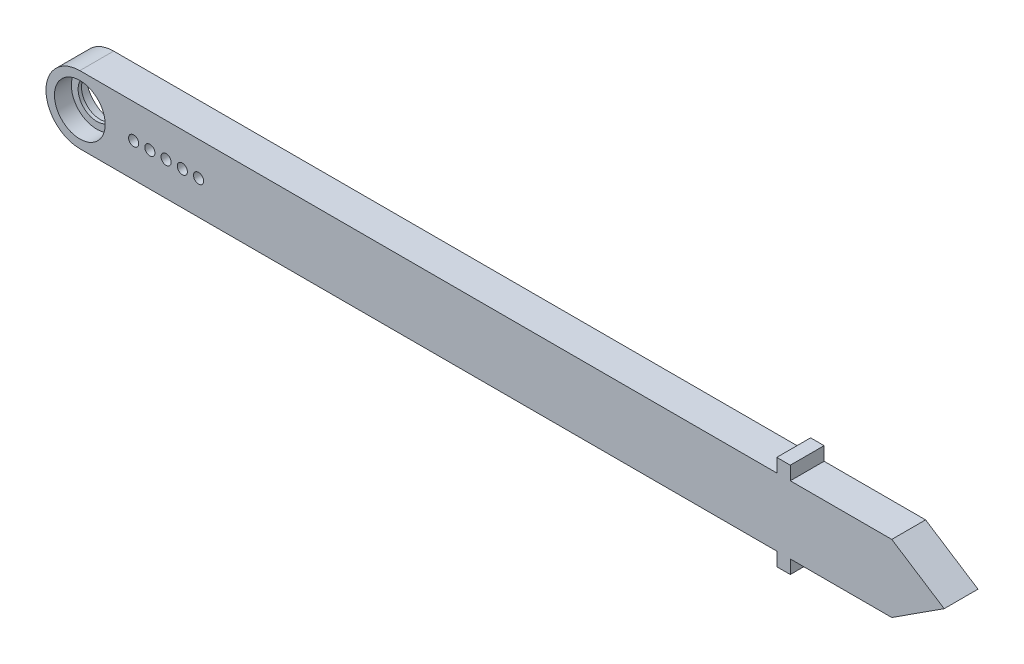
ISO-10303-21;
HEADER;
FILE_DESCRIPTION(('STEP AP214'),'2;1');
FILE_NAME('part.step','',(''),(''),'','','');
FILE_SCHEMA(('AUTOMOTIVE_DESIGN { 1 0 10303 214 1 1 1 1 }'));
ENDSEC;
DATA;
#1=APPLICATION_CONTEXT('core data for automotive mechanical design processes');
#2=APPLICATION_PROTOCOL_DEFINITION('international standard','automotive_design',2000,#1);
#3=PRODUCT_CONTEXT('',#1,'mechanical');
#4=PRODUCT('Part','Part','',(#3));
#5=PRODUCT_RELATED_PRODUCT_CATEGORY('part','',(#4));
#6=PRODUCT_DEFINITION_FORMATION('','',#4);
#7=PRODUCT_DEFINITION_CONTEXT('part definition',#1,'design');
#8=PRODUCT_DEFINITION('design','',#6,#7);
#9=PRODUCT_DEFINITION_SHAPE('','',#8);
#10=(LENGTH_UNIT() NAMED_UNIT(*) SI_UNIT(.MILLI.,.METRE.));
#11=(NAMED_UNIT(*) PLANE_ANGLE_UNIT() SI_UNIT($,.RADIAN.));
#12=(NAMED_UNIT(*) SI_UNIT($,.STERADIAN.) SOLID_ANGLE_UNIT());
#13=UNCERTAINTY_MEASURE_WITH_UNIT(LENGTH_MEASURE(1.E-05),#10,'distance_accuracy_value','');
#14=(GEOMETRIC_REPRESENTATION_CONTEXT(3) GLOBAL_UNCERTAINTY_ASSIGNED_CONTEXT((#13)) GLOBAL_UNIT_ASSIGNED_CONTEXT((#10,
#11,#12)) REPRESENTATION_CONTEXT('',''));
#15=CARTESIAN_POINT('',(0.,0.,0.));
#16=DIRECTION('',(0.,0.,1.));
#17=DIRECTION('',(1.,0.,0.));
#18=AXIS2_PLACEMENT_3D('',#15,#16,#17);
#19=CARTESIAN_POINT('',(0.,-5.,5.));
#20=DIRECTION('',(0.,1.,0.));
#21=DIRECTION('',(0.,0.,1.));
#22=AXIS2_PLACEMENT_3D('',#19,#20,#21);
#23=PLANE('',#22);
#24=DIRECTION('',(1.,0.,0.));
#25=VECTOR('',#24,1.);
#26=CARTESIAN_POINT('',(0.,-5.,5.));
#27=LINE('',#26,#25);
#28=CARTESIAN_POINT('',(105.,-5.,5.));
#29=VERTEX_POINT('',#28);
#30=CARTESIAN_POINT('',(120.,-5.,5.));
#31=VERTEX_POINT('',#30);
#32=EDGE_CURVE('E183',#29,#31,#27,.T.);
#33=ORIENTED_EDGE('',*,*,#32,.F.);
#34=DIRECTION('',(0.,0.,-1.));
#35=VECTOR('',#34,1.);
#36=CARTESIAN_POINT('',(105.,-5.,5.));
#37=LINE('',#36,#35);
#38=CARTESIAN_POINT('',(105.,-5.,0.));
#39=VERTEX_POINT('',#38);
#40=EDGE_CURVE('E230',#29,#39,#37,.T.);
#41=ORIENTED_EDGE('',*,*,#40,.T.);
#42=DIRECTION('',(1.,0.,0.));
#43=VECTOR('',#42,1.);
#44=CARTESIAN_POINT('',(0.,-5.,0.));
#45=LINE('',#44,#43);
#46=CARTESIAN_POINT('',(120.,-5.,0.));
#47=VERTEX_POINT('',#46);
#48=EDGE_CURVE('E289',#39,#47,#45,.T.);
#49=ORIENTED_EDGE('',*,*,#48,.T.);
#50=DIRECTION('',(0.,0.,-1.));
#51=VECTOR('',#50,1.);
#52=CARTESIAN_POINT('',(120.,-5.,5.));
#53=LINE('',#52,#51);
#54=EDGE_CURVE('E11',#31,#47,#53,.T.);
#55=ORIENTED_EDGE('',*,*,#54,.F.);
#56=EDGE_LOOP('',(#33,#41,#49,#55));
#57=FACE_BOUND('',#56,.T.);
#58=ADVANCED_FACE('F40',(#57),#23,.F.);
#59=CARTESIAN_POINT('',(0.,5.,5.));
#60=DIRECTION('',(0.,1.,0.));
#61=DIRECTION('',(0.,0.,1.));
#62=AXIS2_PLACEMENT_3D('',#59,#60,#61);
#63=PLANE('',#62);
#64=DIRECTION('',(1.,0.,0.));
#65=VECTOR('',#64,1.);
#66=CARTESIAN_POINT('',(0.,5.,5.));
#67=LINE('',#66,#65);
#68=CARTESIAN_POINT('',(0.,5.,5.));
#69=VERTEX_POINT('',#68);
#70=CARTESIAN_POINT('',(103.,5.,5.));
#71=VERTEX_POINT('',#70);
#72=EDGE_CURVE('E299',#69,#71,#67,.T.);
#73=ORIENTED_EDGE('',*,*,#72,.T.);
#74=DIRECTION('',(0.,0.,1.));
#75=VECTOR('',#74,1.);
#76=CARTESIAN_POINT('',(103.,5.,0.));
#77=LINE('',#76,#75);
#78=CARTESIAN_POINT('',(103.,5.,0.));
#79=VERTEX_POINT('',#78);
#80=EDGE_CURVE('E233',#79,#71,#77,.T.);
#81=ORIENTED_EDGE('',*,*,#80,.F.);
#82=DIRECTION('',(1.,0.,0.));
#83=VECTOR('',#82,1.);
#84=CARTESIAN_POINT('',(0.,5.,0.));
#85=LINE('',#84,#83);
#86=CARTESIAN_POINT('',(0.,5.,0.));
#87=VERTEX_POINT('',#86);
#88=EDGE_CURVE('E312',#87,#79,#85,.T.);
#89=ORIENTED_EDGE('',*,*,#88,.F.);
#90=DIRECTION('',(0.,0.,-1.));
#91=VECTOR('',#90,1.);
#92=CARTESIAN_POINT('',(0.,5.,5.));
#93=LINE('',#92,#91);
#94=EDGE_CURVE('E319',#69,#87,#93,.T.);
#95=ORIENTED_EDGE('',*,*,#94,.F.);
#96=EDGE_LOOP('',(#73,#81,#89,#95));
#97=FACE_BOUND('',#96,.T.);
#98=ADVANCED_FACE('F372',(#97),#63,.T.);
#99=CARTESIAN_POINT('',(105.,5.,0.));
#100=VERTEX_POINT('',#99);
#101=CARTESIAN_POINT('',(120.,5.,0.));
#102=VERTEX_POINT('',#101);
#103=EDGE_CURVE('E311',#100,#102,#85,.T.);
#104=ORIENTED_EDGE('',*,*,#103,.F.);
#105=DIRECTION('',(0.,0.,-1.));
#106=VECTOR('',#105,1.);
#107=CARTESIAN_POINT('',(105.,5.,0.));
#108=LINE('',#107,#106);
#109=CARTESIAN_POINT('',(105.,5.,5.));
#110=VERTEX_POINT('',#109);
#111=EDGE_CURVE('E238',#110,#100,#108,.T.);
#112=ORIENTED_EDGE('',*,*,#111,.F.);
#113=CARTESIAN_POINT('',(120.,5.,5.));
#114=VERTEX_POINT('',#113);
#115=EDGE_CURVE('E298',#110,#114,#67,.T.);
#116=ORIENTED_EDGE('',*,*,#115,.T.);
#117=DIRECTION('',(0.,0.,-1.));
#118=VECTOR('',#117,1.);
#119=CARTESIAN_POINT('',(120.,5.,5.));
#120=LINE('',#119,#118);
#121=EDGE_CURVE('E49',#114,#102,#120,.T.);
#122=ORIENTED_EDGE('',*,*,#121,.T.);
#123=EDGE_LOOP('',(#104,#112,#116,#122));
#124=FACE_BOUND('',#123,.T.);
#125=ADVANCED_FACE('F377',(#124),#63,.T.);
#126=CARTESIAN_POINT('',(0.,0.,5.));
#127=DIRECTION('',(0.,0.,-1.));
#128=DIRECTION('',(-1.,0.,0.));
#129=AXIS2_PLACEMENT_3D('',#126,#127,#128);
#130=CYLINDRICAL_SURFACE('',#129,3.75);
#131=CARTESIAN_POINT('',(0.,0.,5.));
#132=DIRECTION('',(0.,0.,1.));
#133=DIRECTION('',(1.,0.,0.));
#134=AXIS2_PLACEMENT_3D('',#131,#132,#133);
#135=CIRCLE('',#134,3.75);
#136=CARTESIAN_POINT('',(3.75,0.,5.));
#137=VERTEX_POINT('',#136);
#138=EDGE_CURVE('E304',#137,#137,#135,.T.);
#139=ORIENTED_EDGE('',*,*,#138,.T.);
#140=EDGE_LOOP('',(#139));
#141=FACE_BOUND('',#140,.T.);
#142=CARTESIAN_POINT('',(0.,0.,2.5));
#143=DIRECTION('',(0.,0.,-1.));
#144=DIRECTION('',(-1.,0.,0.));
#145=AXIS2_PLACEMENT_3D('',#142,#143,#144);
#146=CIRCLE('',#145,3.75);
#147=CARTESIAN_POINT('',(-3.75,0.,2.5));
#148=VERTEX_POINT('',#147);
#149=EDGE_CURVE('E258',#148,#148,#146,.T.);
#150=ORIENTED_EDGE('',*,*,#149,.T.);
#151=EDGE_LOOP('',(#150));
#152=FACE_BOUND('',#151,.T.);
#153=ADVANCED_FACE('F381',(#141,#152),#130,.F.);
#154=CARTESIAN_POINT('',(0.,-5.,0.));
#155=VERTEX_POINT('',#154);
#156=CARTESIAN_POINT('',(103.,-5.,0.));
#157=VERTEX_POINT('',#156);
#158=EDGE_CURVE('E308',#155,#157,#45,.T.);
#159=ORIENTED_EDGE('',*,*,#158,.T.);
#160=DIRECTION('',(0.,0.,1.));
#161=VECTOR('',#160,1.);
#162=CARTESIAN_POINT('',(103.,-5.,5.));
#163=LINE('',#162,#161);
#164=CARTESIAN_POINT('',(103.,-5.,5.));
#165=VERTEX_POINT('',#164);
#166=EDGE_CURVE('E223',#157,#165,#163,.T.);
#167=ORIENTED_EDGE('',*,*,#166,.T.);
#168=CARTESIAN_POINT('',(0.,-5.,5.));
#169=VERTEX_POINT('',#168);
#170=EDGE_CURVE('E296',#169,#165,#27,.T.);
#171=ORIENTED_EDGE('',*,*,#170,.F.);
#172=DIRECTION('',(0.,0.,-1.));
#173=VECTOR('',#172,1.);
#174=CARTESIAN_POINT('',(0.,-5.,5.));
#175=LINE('',#174,#173);
#176=EDGE_CURVE('E307',#169,#155,#175,.T.);
#177=ORIENTED_EDGE('',*,*,#176,.T.);
#178=EDGE_LOOP('',(#159,#167,#171,#177));
#179=FACE_BOUND('',#178,.T.);
#180=ADVANCED_FACE('F42',(#179),#23,.F.);
#181=CARTESIAN_POINT('',(0.,0.,5.));
#182=DIRECTION('',(0.,0.,-1.));
#183=DIRECTION('',(-1.,0.,0.));
#184=AXIS2_PLACEMENT_3D('',#181,#182,#183);
#185=CYLINDRICAL_SURFACE('',#184,5.);
#186=CARTESIAN_POINT('',(0.,0.,0.));
#187=DIRECTION('',(0.,0.,1.));
#188=DIRECTION('',(1.,0.,0.));
#189=AXIS2_PLACEMENT_3D('',#186,#187,#188);
#190=CIRCLE('',#189,5.);
#191=EDGE_CURVE('E315',#87,#155,#190,.T.);
#192=ORIENTED_EDGE('',*,*,#191,.T.);
#193=ORIENTED_EDGE('',*,*,#176,.F.);
#194=CARTESIAN_POINT('',(0.,0.,5.));
#195=DIRECTION('',(0.,0.,1.));
#196=DIRECTION('',(1.,0.,0.));
#197=AXIS2_PLACEMENT_3D('',#194,#195,#196);
#198=CIRCLE('',#197,5.);
#199=EDGE_CURVE('E302',#69,#169,#198,.T.);
#200=ORIENTED_EDGE('',*,*,#199,.F.);
#201=ORIENTED_EDGE('',*,*,#94,.T.);
#202=EDGE_LOOP('',(#192,#193,#200,#201));
#203=FACE_BOUND('',#202,.T.);
#204=ADVANCED_FACE('F380',(#203),#185,.T.);
#205=CARTESIAN_POINT('',(0.,0.,5.));
#206=DIRECTION('',(0.,0.,1.));
#207=DIRECTION('',(1.,0.,0.));
#208=AXIS2_PLACEMENT_3D('',#205,#206,#207);
#209=PLANE('',#208);
#210=CARTESIAN_POINT('',(17.55,0.,5.));
#211=DIRECTION('',(0.,0.,-1.));
#212=DIRECTION('',(-1.,0.,0.));
#213=AXIS2_PLACEMENT_3D('',#210,#211,#212);
#214=CIRCLE('',#213,0.749999999999998);
#215=CARTESIAN_POINT('',(16.8,0.,5.));
#216=VERTEX_POINT('',#215);
#217=EDGE_CURVE('E194',#216,#216,#214,.T.);
#218=ORIENTED_EDGE('',*,*,#217,.T.);
#219=EDGE_LOOP('',(#218));
#220=FACE_BOUND('',#219,.T.);
#221=CARTESIAN_POINT('',(10.35,0.,5.));
#222=DIRECTION('',(0.,0.,-1.));
#223=DIRECTION('',(-1.,0.,0.));
#224=AXIS2_PLACEMENT_3D('',#221,#222,#223);
#225=CIRCLE('',#224,0.75);
#226=CARTESIAN_POINT('',(9.6,0.,5.));
#227=VERTEX_POINT('',#226);
#228=EDGE_CURVE('E198',#227,#227,#225,.T.);
#229=ORIENTED_EDGE('',*,*,#228,.T.);
#230=EDGE_LOOP('',(#229));
#231=FACE_BOUND('',#230,.T.);
#232=CARTESIAN_POINT('',(7.95,0.,5.));
#233=DIRECTION('',(0.,0.,-1.));
#234=DIRECTION('',(-1.,0.,0.));
#235=AXIS2_PLACEMENT_3D('',#232,#233,#234);
#236=CIRCLE('',#235,0.75);
#237=CARTESIAN_POINT('',(7.2,0.,5.));
#238=VERTEX_POINT('',#237);
#239=EDGE_CURVE('E201',#238,#238,#236,.T.);
#240=ORIENTED_EDGE('',*,*,#239,.T.);
#241=EDGE_LOOP('',(#240));
#242=FACE_BOUND('',#241,.T.);
#243=CARTESIAN_POINT('',(12.75,0.,5.));
#244=DIRECTION('',(0.,0.,-1.));
#245=DIRECTION('',(-1.,0.,0.));
#246=AXIS2_PLACEMENT_3D('',#243,#244,#245);
#247=CIRCLE('',#246,0.75);
#248=CARTESIAN_POINT('',(12.,0.,5.));
#249=VERTEX_POINT('',#248);
#250=EDGE_CURVE('E204',#249,#249,#247,.T.);
#251=ORIENTED_EDGE('',*,*,#250,.T.);
#252=EDGE_LOOP('',(#251));
#253=FACE_BOUND('',#252,.T.);
#254=CARTESIAN_POINT('',(15.15,0.,5.));
#255=DIRECTION('',(0.,0.,-1.));
#256=DIRECTION('',(-1.,0.,0.));
#257=AXIS2_PLACEMENT_3D('',#254,#255,#256);
#258=CIRCLE('',#257,0.75);
#259=CARTESIAN_POINT('',(14.4,0.,5.));
#260=VERTEX_POINT('',#259);
#261=EDGE_CURVE('E193',#260,#260,#258,.T.);
#262=ORIENTED_EDGE('',*,*,#261,.T.);
#263=EDGE_LOOP('',(#262));
#264=FACE_BOUND('',#263,.T.);
#265=ORIENTED_EDGE('',*,*,#170,.T.);
#266=DIRECTION('',(0.,1.,0.));
#267=VECTOR('',#266,1.);
#268=CARTESIAN_POINT('',(103.,-7.,5.));
#269=LINE('',#268,#267);
#270=CARTESIAN_POINT('',(103.,-7.,5.));
#271=VERTEX_POINT('',#270);
#272=EDGE_CURVE('E57',#271,#165,#269,.T.);
#273=ORIENTED_EDGE('',*,*,#272,.F.);
#274=DIRECTION('',(1.,0.,0.));
#275=VECTOR('',#274,1.);
#276=CARTESIAN_POINT('',(103.,-7.,5.));
#277=LINE('',#276,#275);
#278=CARTESIAN_POINT('',(105.,-7.,5.));
#279=VERTEX_POINT('',#278);
#280=EDGE_CURVE('E214',#271,#279,#277,.T.);
#281=ORIENTED_EDGE('',*,*,#280,.T.);
#282=DIRECTION('',(0.,1.,0.));
#283=VECTOR('',#282,1.);
#284=CARTESIAN_POINT('',(105.,-7.,5.));
#285=LINE('',#284,#283);
#286=EDGE_CURVE('E224',#279,#29,#285,.T.);
#287=ORIENTED_EDGE('',*,*,#286,.T.);
#288=ORIENTED_EDGE('',*,*,#32,.T.);
#289=DIRECTION('',(0.840080797820582,0.542461291829319,0.));
#290=VECTOR('',#289,1.);
#291=CARTESIAN_POINT('',(127.743232655252,0.,5.));
#292=LINE('',#291,#290);
#293=CARTESIAN_POINT('',(127.743232655252,0.,5.));
#294=VERTEX_POINT('',#293);
#295=EDGE_CURVE('E166',#31,#294,#292,.T.);
#296=ORIENTED_EDGE('',*,*,#295,.T.);
#297=DIRECTION('',(-0.840080797820582,0.542461291829319,0.));
#298=VECTOR('',#297,1.);
#299=CARTESIAN_POINT('',(120.,5.,5.));
#300=LINE('',#299,#298);
#301=EDGE_CURVE('E173',#294,#114,#300,.T.);
#302=ORIENTED_EDGE('',*,*,#301,.T.);
#303=ORIENTED_EDGE('',*,*,#115,.F.);
#304=DIRECTION('',(0.,-1.,0.));
#305=VECTOR('',#304,1.);
#306=CARTESIAN_POINT('',(105.,7.,5.));
#307=LINE('',#306,#305);
#308=CARTESIAN_POINT('',(105.,7.,5.));
#309=VERTEX_POINT('',#308);
#310=EDGE_CURVE('E247',#309,#110,#307,.T.);
#311=ORIENTED_EDGE('',*,*,#310,.F.);
#312=DIRECTION('',(1.,0.,0.));
#313=VECTOR('',#312,1.);
#314=CARTESIAN_POINT('',(103.,7.,5.));
#315=LINE('',#314,#313);
#316=CARTESIAN_POINT('',(103.,7.,5.));
#317=VERTEX_POINT('',#316);
#318=EDGE_CURVE('E240',#317,#309,#315,.T.);
#319=ORIENTED_EDGE('',*,*,#318,.F.);
#320=DIRECTION('',(0.,-1.,0.));
#321=VECTOR('',#320,1.);
#322=CARTESIAN_POINT('',(103.,7.,5.));
#323=LINE('',#322,#321);
#324=EDGE_CURVE('E249',#317,#71,#323,.T.);
#325=ORIENTED_EDGE('',*,*,#324,.T.);
#326=ORIENTED_EDGE('',*,*,#72,.F.);
#327=ORIENTED_EDGE('',*,*,#199,.T.);
#328=EDGE_LOOP('',(#265,#273,#281,#287,#288,#296,#302,#303,#311,#319,#325,#326,#327));
#329=FACE_BOUND('',#328,.T.);
#330=ORIENTED_EDGE('',*,*,#138,.F.);
#331=EDGE_LOOP('',(#330));
#332=FACE_BOUND('',#331,.T.);
#333=ADVANCED_FACE('F178',(#220,#231,#242,#253,#264,#329,#332),#209,.T.);
#334=CARTESIAN_POINT('',(0.,0.,0.));
#335=DIRECTION('',(0.,0.,1.));
#336=DIRECTION('',(1.,0.,0.));
#337=AXIS2_PLACEMENT_3D('',#334,#335,#336);
#338=PLANE('',#337);
#339=DIRECTION('',(-0.996512851135206,-0.0834394242692445,0.));
#340=VECTOR('',#339,1.);
#341=CARTESIAN_POINT('',(16.1297188837247,-2.74943592473536,0.));
#342=LINE('',#341,#340);
#343=CARTESIAN_POINT('',(16.1297188837247,-2.74943592473536,0.));
#344=VERTEX_POINT('',#343);
#345=CARTESIAN_POINT('',(0.,-4.1,0.));
#346=VERTEX_POINT('',#345);
#347=EDGE_CURVE('E279',#344,#346,#342,.T.);
#348=ORIENTED_EDGE('',*,*,#347,.F.);
#349=CARTESIAN_POINT('',(15.6,0.,0.));
#350=DIRECTION('',(0.,0.,-1.));
#351=DIRECTION('',(-1.,0.,0.));
#352=AXIS2_PLACEMENT_3D('',#349,#350,#351);
#353=CIRCLE('',#352,2.8);
#354=CARTESIAN_POINT('',(16.1297188837248,2.74943592473537,0.));
#355=VERTEX_POINT('',#354);
#356=EDGE_CURVE('E263',#355,#344,#353,.T.);
#357=ORIENTED_EDGE('',*,*,#356,.F.);
#358=DIRECTION('',(0.996512851135206,-0.0834394242692436,0.));
#359=VECTOR('',#358,1.);
#360=CARTESIAN_POINT('',(16.1297188837248,2.74943592473537,0.));
#361=LINE('',#360,#359);
#362=CARTESIAN_POINT('',(0.,4.1,0.));
#363=VERTEX_POINT('',#362);
#364=EDGE_CURVE('E268',#363,#355,#361,.T.);
#365=ORIENTED_EDGE('',*,*,#364,.F.);
#366=CARTESIAN_POINT('',(0.,0.,0.));
#367=DIRECTION('',(0.,0.,-1.));
#368=DIRECTION('',(-1.,0.,0.));
#369=AXIS2_PLACEMENT_3D('',#366,#367,#368);
#370=CIRCLE('',#369,4.1);
#371=EDGE_CURVE('E282',#346,#363,#370,.T.);
#372=ORIENTED_EDGE('',*,*,#371,.F.);
#373=EDGE_LOOP('',(#348,#357,#365,#372));
#374=FACE_BOUND('',#373,.T.);
#375=ORIENTED_EDGE('',*,*,#88,.T.);
#376=DIRECTION('',(0.,-1.,0.));
#377=VECTOR('',#376,1.);
#378=CARTESIAN_POINT('',(103.,7.,0.));
#379=LINE('',#378,#377);
#380=CARTESIAN_POINT('',(103.,7.,0.));
#381=VERTEX_POINT('',#380);
#382=EDGE_CURVE('E252',#381,#79,#379,.T.);
#383=ORIENTED_EDGE('',*,*,#382,.F.);
#384=DIRECTION('',(-1.,0.,0.));
#385=VECTOR('',#384,1.);
#386=CARTESIAN_POINT('',(103.,7.,0.));
#387=LINE('',#386,#385);
#388=CARTESIAN_POINT('',(105.,7.,0.));
#389=VERTEX_POINT('',#388);
#390=EDGE_CURVE('E234',#389,#381,#387,.T.);
#391=ORIENTED_EDGE('',*,*,#390,.F.);
#392=DIRECTION('',(0.,-1.,0.));
#393=VECTOR('',#392,1.);
#394=CARTESIAN_POINT('',(105.,7.,0.));
#395=LINE('',#394,#393);
#396=EDGE_CURVE('E65',#389,#100,#395,.T.);
#397=ORIENTED_EDGE('',*,*,#396,.T.);
#398=ORIENTED_EDGE('',*,*,#103,.T.);
#399=DIRECTION('',(0.840080797820583,-0.542461291829319,0.));
#400=VECTOR('',#399,1.);
#401=CARTESIAN_POINT('',(120.,5.,0.));
#402=LINE('',#401,#400);
#403=CARTESIAN_POINT('',(127.743232655252,0.,0.));
#404=VERTEX_POINT('',#403);
#405=EDGE_CURVE('E172',#102,#404,#402,.T.);
#406=ORIENTED_EDGE('',*,*,#405,.T.);
#407=DIRECTION('',(-0.840080797820583,-0.542461291829319,0.));
#408=VECTOR('',#407,1.);
#409=CARTESIAN_POINT('',(127.743232655252,0.,0.));
#410=LINE('',#409,#408);
#411=EDGE_CURVE('E168',#404,#47,#410,.T.);
#412=ORIENTED_EDGE('',*,*,#411,.T.);
#413=ORIENTED_EDGE('',*,*,#48,.F.);
#414=DIRECTION('',(0.,1.,0.));
#415=VECTOR('',#414,1.);
#416=CARTESIAN_POINT('',(105.,-7.,0.));
#417=LINE('',#416,#415);
#418=CARTESIAN_POINT('',(105.,-7.,0.));
#419=VERTEX_POINT('',#418);
#420=EDGE_CURVE('E221',#419,#39,#417,.T.);
#421=ORIENTED_EDGE('',*,*,#420,.F.);
#422=DIRECTION('',(-1.,0.,0.));
#423=VECTOR('',#422,1.);
#424=CARTESIAN_POINT('',(103.,-7.,0.));
#425=LINE('',#424,#423);
#426=CARTESIAN_POINT('',(103.,-7.,0.));
#427=VERTEX_POINT('',#426);
#428=EDGE_CURVE('E209',#419,#427,#425,.T.);
#429=ORIENTED_EDGE('',*,*,#428,.T.);
#430=DIRECTION('',(0.,1.,0.));
#431=VECTOR('',#430,1.);
#432=CARTESIAN_POINT('',(103.,-7.,0.));
#433=LINE('',#432,#431);
#434=EDGE_CURVE('E220',#427,#157,#433,.T.);
#435=ORIENTED_EDGE('',*,*,#434,.T.);
#436=ORIENTED_EDGE('',*,*,#158,.F.);
#437=ORIENTED_EDGE('',*,*,#191,.F.);
#438=EDGE_LOOP('',(#375,#383,#391,#397,#398,#406,#412,#413,#421,#429,#435,#436,#437));
#439=FACE_BOUND('',#438,.T.);
#440=ADVANCED_FACE('F395',(#374,#439),#338,.F.);
#441=CARTESIAN_POINT('',(15.6,0.,2.));
#442=DIRECTION('',(0.,0.,-1.));
#443=DIRECTION('',(-1.,0.,0.));
#444=AXIS2_PLACEMENT_3D('',#441,#442,#443);
#445=CYLINDRICAL_SURFACE('',#444,2.8);
#446=ORIENTED_EDGE('',*,*,#356,.T.);
#447=DIRECTION('',(0.,0.,-1.));
#448=VECTOR('',#447,1.);
#449=CARTESIAN_POINT('',(16.1297188837247,-2.74943592473536,2.));
#450=LINE('',#449,#448);
#451=CARTESIAN_POINT('',(16.1297188837247,-2.74943592473536,2.));
#452=VERTEX_POINT('',#451);
#453=EDGE_CURVE('E277',#452,#344,#450,.T.);
#454=ORIENTED_EDGE('',*,*,#453,.F.);
#455=CARTESIAN_POINT('',(15.6,0.,2.));
#456=DIRECTION('',(0.,0.,-1.));
#457=DIRECTION('',(-1.,0.,0.));
#458=AXIS2_PLACEMENT_3D('',#455,#456,#457);
#459=CIRCLE('',#458,2.8);
#460=CARTESIAN_POINT('',(16.1297188837248,2.74943592473537,2.));
#461=VERTEX_POINT('',#460);
#462=EDGE_CURVE('E264',#461,#452,#459,.T.);
#463=ORIENTED_EDGE('',*,*,#462,.F.);
#464=DIRECTION('',(0.,0.,-1.));
#465=VECTOR('',#464,1.);
#466=CARTESIAN_POINT('',(16.1297188837248,2.74943592473537,2.));
#467=LINE('',#466,#465);
#468=EDGE_CURVE('E287',#461,#355,#467,.T.);
#469=ORIENTED_EDGE('',*,*,#468,.T.);
#470=EDGE_LOOP('',(#446,#454,#463,#469));
#471=FACE_BOUND('',#470,.T.);
#472=ADVANCED_FACE('F553',(#471),#445,.F.);
#473=CARTESIAN_POINT('',(16.1297188837248,2.74943592473537,2.));
#474=DIRECTION('',(0.0834394242692436,0.996512851135206,0.));
#475=DIRECTION('',(-0.996512851135206,0.0834394242692436,0.));
#476=AXIS2_PLACEMENT_3D('',#473,#474,#475);
#477=PLANE('',#476);
#478=ORIENTED_EDGE('',*,*,#364,.T.);
#479=ORIENTED_EDGE('',*,*,#468,.F.);
#480=DIRECTION('',(0.996512851135206,-0.0834394242692436,0.));
#481=VECTOR('',#480,1.);
#482=CARTESIAN_POINT('',(16.1297188837248,2.74943592473537,2.));
#483=LINE('',#482,#481);
#484=CARTESIAN_POINT('',(0.,4.1,2.));
#485=VERTEX_POINT('',#484);
#486=EDGE_CURVE('E274',#485,#461,#483,.T.);
#487=ORIENTED_EDGE('',*,*,#486,.F.);
#488=DIRECTION('',(0.,0.,-1.));
#489=VECTOR('',#488,1.);
#490=CARTESIAN_POINT('',(0.,4.1,2.));
#491=LINE('',#490,#489);
#492=EDGE_CURVE('E290',#485,#363,#491,.T.);
#493=ORIENTED_EDGE('',*,*,#492,.T.);
#494=EDGE_LOOP('',(#478,#479,#487,#493));
#495=FACE_BOUND('',#494,.T.);
#496=ADVANCED_FACE('F577',(#495),#477,.F.);
#497=CARTESIAN_POINT('',(0.,0.,2.));
#498=DIRECTION('',(0.,0.,-1.));
#499=DIRECTION('',(-1.,0.,0.));
#500=AXIS2_PLACEMENT_3D('',#497,#498,#499);
#501=CYLINDRICAL_SURFACE('',#500,4.1);
#502=ORIENTED_EDGE('',*,*,#371,.T.);
#503=ORIENTED_EDGE('',*,*,#492,.F.);
#504=CARTESIAN_POINT('',(0.,0.,2.));
#505=DIRECTION('',(0.,0.,-1.));
#506=DIRECTION('',(-1.,0.,0.));
#507=AXIS2_PLACEMENT_3D('',#504,#505,#506);
#508=CIRCLE('',#507,4.1);
#509=CARTESIAN_POINT('',(0.,-4.1,2.));
#510=VERTEX_POINT('',#509);
#511=EDGE_CURVE('E271',#510,#485,#508,.T.);
#512=ORIENTED_EDGE('',*,*,#511,.F.);
#513=DIRECTION('',(0.,0.,-1.));
#514=VECTOR('',#513,1.);
#515=CARTESIAN_POINT('',(0.,-4.1,2.));
#516=LINE('',#515,#514);
#517=EDGE_CURVE('E292',#510,#346,#516,.T.);
#518=ORIENTED_EDGE('',*,*,#517,.T.);
#519=EDGE_LOOP('',(#502,#503,#512,#518));
#520=FACE_BOUND('',#519,.T.);
#521=ADVANCED_FACE('F586',(#520),#501,.F.);
#522=CARTESIAN_POINT('',(16.1297188837247,-2.74943592473536,2.));
#523=DIRECTION('',(0.0834394242692444,-0.996512851135206,0.));
#524=DIRECTION('',(0.996512851135206,0.0834394242692444,0.));
#525=AXIS2_PLACEMENT_3D('',#522,#523,#524);
#526=PLANE('',#525);
#527=ORIENTED_EDGE('',*,*,#347,.T.);
#528=ORIENTED_EDGE('',*,*,#517,.F.);
#529=DIRECTION('',(-0.996512851135206,-0.0834394242692445,0.));
#530=VECTOR('',#529,1.);
#531=CARTESIAN_POINT('',(16.1297188837247,-2.74943592473536,2.));
#532=LINE('',#531,#530);
#533=EDGE_CURVE('E267',#452,#510,#532,.T.);
#534=ORIENTED_EDGE('',*,*,#533,.F.);
#535=ORIENTED_EDGE('',*,*,#453,.T.);
#536=EDGE_LOOP('',(#527,#528,#534,#535));
#537=FACE_BOUND('',#536,.T.);
#538=ADVANCED_FACE('F343',(#537),#526,.F.);
#539=CARTESIAN_POINT('',(15.6,0.,2.));
#540=DIRECTION('',(0.,0.,-1.));
#541=DIRECTION('',(-1.,0.,0.));
#542=AXIS2_PLACEMENT_3D('',#539,#540,#541);
#543=PLANE('',#542);
#544=CARTESIAN_POINT('',(17.55,0.,2.));
#545=DIRECTION('',(0.,0.,-1.));
#546=DIRECTION('',(-1.,0.,0.));
#547=AXIS2_PLACEMENT_3D('',#544,#545,#546);
#548=CIRCLE('',#547,0.749999999999998);
#549=CARTESIAN_POINT('',(16.8,0.,2.));
#550=VERTEX_POINT('',#549);
#551=EDGE_CURVE('E44',#550,#550,#548,.T.);
#552=ORIENTED_EDGE('',*,*,#551,.F.);
#553=EDGE_LOOP('',(#552));
#554=FACE_BOUND('',#553,.T.);
#555=CARTESIAN_POINT('',(10.35,0.,2.));
#556=DIRECTION('',(0.,0.,-1.));
#557=DIRECTION('',(-1.,0.,0.));
#558=AXIS2_PLACEMENT_3D('',#555,#556,#557);
#559=CIRCLE('',#558,0.75);
#560=CARTESIAN_POINT('',(9.6,0.,2.));
#561=VERTEX_POINT('',#560);
#562=EDGE_CURVE('E329',#561,#561,#559,.T.);
#563=ORIENTED_EDGE('',*,*,#562,.F.);
#564=EDGE_LOOP('',(#563));
#565=FACE_BOUND('',#564,.T.);
#566=CARTESIAN_POINT('',(7.95,0.,2.));
#567=DIRECTION('',(0.,0.,-1.));
#568=DIRECTION('',(-1.,0.,0.));
#569=AXIS2_PLACEMENT_3D('',#566,#567,#568);
#570=CIRCLE('',#569,0.75);
#571=CARTESIAN_POINT('',(7.2,0.,2.));
#572=VERTEX_POINT('',#571);
#573=EDGE_CURVE('E327',#572,#572,#570,.T.);
#574=ORIENTED_EDGE('',*,*,#573,.F.);
#575=EDGE_LOOP('',(#574));
#576=FACE_BOUND('',#575,.T.);
#577=CARTESIAN_POINT('',(12.75,0.,2.));
#578=DIRECTION('',(0.,0.,-1.));
#579=DIRECTION('',(-1.,0.,0.));
#580=AXIS2_PLACEMENT_3D('',#577,#578,#579);
#581=CIRCLE('',#580,0.75);
#582=CARTESIAN_POINT('',(12.,0.,2.));
#583=VERTEX_POINT('',#582);
#584=EDGE_CURVE('E324',#583,#583,#581,.T.);
#585=ORIENTED_EDGE('',*,*,#584,.F.);
#586=EDGE_LOOP('',(#585));
#587=FACE_BOUND('',#586,.T.);
#588=CARTESIAN_POINT('',(15.15,0.,2.));
#589=DIRECTION('',(0.,0.,-1.));
#590=DIRECTION('',(-1.,0.,0.));
#591=AXIS2_PLACEMENT_3D('',#588,#589,#590);
#592=CIRCLE('',#591,0.75);
#593=CARTESIAN_POINT('',(14.4,0.,2.));
#594=VERTEX_POINT('',#593);
#595=EDGE_CURVE('E197',#594,#594,#592,.T.);
#596=ORIENTED_EDGE('',*,*,#595,.F.);
#597=EDGE_LOOP('',(#596));
#598=FACE_BOUND('',#597,.T.);
#599=ORIENTED_EDGE('',*,*,#462,.T.);
#600=ORIENTED_EDGE('',*,*,#533,.T.);
#601=ORIENTED_EDGE('',*,*,#511,.T.);
#602=ORIENTED_EDGE('',*,*,#486,.T.);
#603=EDGE_LOOP('',(#599,#600,#601,#602));
#604=FACE_BOUND('',#603,.T.);
#605=CARTESIAN_POINT('',(0.,0.,2.));
#606=DIRECTION('',(0.,0.,-1.));
#607=DIRECTION('',(-1.,0.,0.));
#608=AXIS2_PLACEMENT_3D('',#605,#606,#607);
#609=CIRCLE('',#608,2.75);
#610=CARTESIAN_POINT('',(-2.75,0.,2.));
#611=VERTEX_POINT('',#610);
#612=EDGE_CURVE('E254',#611,#611,#609,.T.);
#613=ORIENTED_EDGE('',*,*,#612,.F.);
#614=EDGE_LOOP('',(#613));
#615=FACE_BOUND('',#614,.T.);
#616=ADVANCED_FACE('F339',(#554,#565,#576,#587,#598,#604,#615),#543,.T.);
#617=CARTESIAN_POINT('',(0.,0.,2.5));
#618=DIRECTION('',(0.,0.,-1.));
#619=DIRECTION('',(-1.,0.,0.));
#620=AXIS2_PLACEMENT_3D('',#617,#618,#619);
#621=PLANE('',#620);
#622=CARTESIAN_POINT('',(0.,0.,2.5));
#623=DIRECTION('',(0.,0.,-1.));
#624=DIRECTION('',(-1.,0.,0.));
#625=AXIS2_PLACEMENT_3D('',#622,#623,#624);
#626=CIRCLE('',#625,2.75);
#627=CARTESIAN_POINT('',(-2.75,0.,2.5));
#628=VERTEX_POINT('',#627);
#629=EDGE_CURVE('E255',#628,#628,#626,.T.);
#630=ORIENTED_EDGE('',*,*,#629,.T.);
#631=EDGE_LOOP('',(#630));
#632=FACE_BOUND('',#631,.T.);
#633=ORIENTED_EDGE('',*,*,#149,.F.);
#634=EDGE_LOOP('',(#633));
#635=FACE_BOUND('',#634,.T.);
#636=ADVANCED_FACE('F342',(#632,#635),#621,.F.);
#637=CARTESIAN_POINT('',(0.,0.,2.5));
#638=DIRECTION('',(0.,0.,-1.));
#639=DIRECTION('',(-1.,0.,0.));
#640=AXIS2_PLACEMENT_3D('',#637,#638,#639);
#641=CYLINDRICAL_SURFACE('',#640,2.75);
#642=ORIENTED_EDGE('',*,*,#629,.F.);
#643=EDGE_LOOP('',(#642));
#644=FACE_BOUND('',#643,.T.);
#645=ORIENTED_EDGE('',*,*,#612,.T.);
#646=EDGE_LOOP('',(#645));
#647=FACE_BOUND('',#646,.T.);
#648=ADVANCED_FACE('F356',(#644,#647),#641,.F.);
#649=CARTESIAN_POINT('',(103.,7.,0.));
#650=DIRECTION('',(1.,0.,0.));
#651=DIRECTION('',(0.,0.,-1.));
#652=AXIS2_PLACEMENT_3D('',#649,#650,#651);
#653=PLANE('',#652);
#654=ORIENTED_EDGE('',*,*,#80,.T.);
#655=ORIENTED_EDGE('',*,*,#324,.F.);
#656=DIRECTION('',(0.,0.,1.));
#657=VECTOR('',#656,1.);
#658=CARTESIAN_POINT('',(103.,7.,0.));
#659=LINE('',#658,#657);
#660=EDGE_CURVE('E237',#381,#317,#659,.T.);
#661=ORIENTED_EDGE('',*,*,#660,.F.);
#662=ORIENTED_EDGE('',*,*,#382,.T.);
#663=EDGE_LOOP('',(#654,#655,#661,#662));
#664=FACE_BOUND('',#663,.T.);
#665=ADVANCED_FACE('F358',(#664),#653,.F.);
#666=CARTESIAN_POINT('',(105.,7.,0.));
#667=DIRECTION('',(-1.,0.,0.));
#668=DIRECTION('',(0.,0.,1.));
#669=AXIS2_PLACEMENT_3D('',#666,#667,#668);
#670=PLANE('',#669);
#671=ORIENTED_EDGE('',*,*,#111,.T.);
#672=ORIENTED_EDGE('',*,*,#396,.F.);
#673=DIRECTION('',(0.,0.,-1.));
#674=VECTOR('',#673,1.);
#675=CARTESIAN_POINT('',(105.,7.,0.));
#676=LINE('',#675,#674);
#677=EDGE_CURVE('E242',#309,#389,#676,.T.);
#678=ORIENTED_EDGE('',*,*,#677,.F.);
#679=ORIENTED_EDGE('',*,*,#310,.T.);
#680=EDGE_LOOP('',(#671,#672,#678,#679));
#681=FACE_BOUND('',#680,.T.);
#682=ADVANCED_FACE('F365',(#681),#670,.F.);
#683=CARTESIAN_POINT('',(0.,7.,0.));
#684=DIRECTION('',(0.,-1.,0.));
#685=DIRECTION('',(0.,0.,-1.));
#686=AXIS2_PLACEMENT_3D('',#683,#684,#685);
#687=PLANE('',#686);
#688=ORIENTED_EDGE('',*,*,#390,.T.);
#689=ORIENTED_EDGE('',*,*,#660,.T.);
#690=ORIENTED_EDGE('',*,*,#318,.T.);
#691=ORIENTED_EDGE('',*,*,#677,.T.);
#692=EDGE_LOOP('',(#688,#689,#690,#691));
#693=FACE_BOUND('',#692,.T.);
#694=ADVANCED_FACE('F411',(#693),#687,.F.);
#695=CARTESIAN_POINT('',(105.,-7.,0.));
#696=DIRECTION('',(1.,0.,0.));
#697=DIRECTION('',(0.,0.,-1.));
#698=AXIS2_PLACEMENT_3D('',#695,#696,#697);
#699=PLANE('',#698);
#700=ORIENTED_EDGE('',*,*,#40,.F.);
#701=ORIENTED_EDGE('',*,*,#286,.F.);
#702=DIRECTION('',(0.,0.,-1.));
#703=VECTOR('',#702,1.);
#704=CARTESIAN_POINT('',(105.,-7.,0.));
#705=LINE('',#704,#703);
#706=EDGE_CURVE('E217',#279,#419,#705,.T.);
#707=ORIENTED_EDGE('',*,*,#706,.T.);
#708=ORIENTED_EDGE('',*,*,#420,.T.);
#709=EDGE_LOOP('',(#700,#701,#707,#708));
#710=FACE_BOUND('',#709,.T.);
#711=ADVANCED_FACE('F420',(#710),#699,.T.);
#712=CARTESIAN_POINT('',(103.,-7.,0.));
#713=DIRECTION('',(-1.,0.,0.));
#714=DIRECTION('',(0.,0.,1.));
#715=AXIS2_PLACEMENT_3D('',#712,#713,#714);
#716=PLANE('',#715);
#717=ORIENTED_EDGE('',*,*,#166,.F.);
#718=ORIENTED_EDGE('',*,*,#434,.F.);
#719=DIRECTION('',(0.,0.,1.));
#720=VECTOR('',#719,1.);
#721=CARTESIAN_POINT('',(103.,-7.,0.));
#722=LINE('',#721,#720);
#723=EDGE_CURVE('E212',#427,#271,#722,.T.);
#724=ORIENTED_EDGE('',*,*,#723,.T.);
#725=ORIENTED_EDGE('',*,*,#272,.T.);
#726=EDGE_LOOP('',(#717,#718,#724,#725));
#727=FACE_BOUND('',#726,.T.);
#728=ADVANCED_FACE('F399',(#727),#716,.T.);
#729=CARTESIAN_POINT('',(0.,-7.,0.));
#730=DIRECTION('',(0.,-1.,0.));
#731=DIRECTION('',(0.,0.,-1.));
#732=AXIS2_PLACEMENT_3D('',#729,#730,#731);
#733=PLANE('',#732);
#734=ORIENTED_EDGE('',*,*,#428,.F.);
#735=ORIENTED_EDGE('',*,*,#706,.F.);
#736=ORIENTED_EDGE('',*,*,#280,.F.);
#737=ORIENTED_EDGE('',*,*,#723,.F.);
#738=EDGE_LOOP('',(#734,#735,#736,#737));
#739=FACE_BOUND('',#738,.T.);
#740=ADVANCED_FACE('F402',(#739),#733,.T.);
#741=CARTESIAN_POINT('',(15.15,0.,5.));
#742=DIRECTION('',(0.,0.,-1.));
#743=DIRECTION('',(-1.,0.,0.));
#744=AXIS2_PLACEMENT_3D('',#741,#742,#743);
#745=CYLINDRICAL_SURFACE('',#744,0.75);
#746=ORIENTED_EDGE('',*,*,#595,.T.);
#747=EDGE_LOOP('',(#746));
#748=FACE_BOUND('',#747,.T.);
#749=ORIENTED_EDGE('',*,*,#261,.F.);
#750=EDGE_LOOP('',(#749));
#751=FACE_BOUND('',#750,.T.);
#752=ADVANCED_FACE('F467',(#748,#751),#745,.F.);
#753=CARTESIAN_POINT('',(12.75,0.,5.));
#754=DIRECTION('',(0.,0.,-1.));
#755=DIRECTION('',(-1.,0.,0.));
#756=AXIS2_PLACEMENT_3D('',#753,#754,#755);
#757=CYLINDRICAL_SURFACE('',#756,0.75);
#758=ORIENTED_EDGE('',*,*,#584,.T.);
#759=EDGE_LOOP('',(#758));
#760=FACE_BOUND('',#759,.T.);
#761=ORIENTED_EDGE('',*,*,#250,.F.);
#762=EDGE_LOOP('',(#761));
#763=FACE_BOUND('',#762,.T.);
#764=ADVANCED_FACE('F485',(#760,#763),#757,.F.);
#765=CARTESIAN_POINT('',(7.95,0.,5.));
#766=DIRECTION('',(0.,0.,-1.));
#767=DIRECTION('',(-1.,0.,0.));
#768=AXIS2_PLACEMENT_3D('',#765,#766,#767);
#769=CYLINDRICAL_SURFACE('',#768,0.75);
#770=ORIENTED_EDGE('',*,*,#573,.T.);
#771=EDGE_LOOP('',(#770));
#772=FACE_BOUND('',#771,.T.);
#773=ORIENTED_EDGE('',*,*,#239,.F.);
#774=EDGE_LOOP('',(#773));
#775=FACE_BOUND('',#774,.T.);
#776=ADVANCED_FACE('F494',(#772,#775),#769,.F.);
#777=CARTESIAN_POINT('',(10.35,0.,5.));
#778=DIRECTION('',(0.,0.,-1.));
#779=DIRECTION('',(-1.,0.,0.));
#780=AXIS2_PLACEMENT_3D('',#777,#778,#779);
#781=CYLINDRICAL_SURFACE('',#780,0.75);
#782=ORIENTED_EDGE('',*,*,#562,.T.);
#783=EDGE_LOOP('',(#782));
#784=FACE_BOUND('',#783,.T.);
#785=ORIENTED_EDGE('',*,*,#228,.F.);
#786=EDGE_LOOP('',(#785));
#787=FACE_BOUND('',#786,.T.);
#788=ADVANCED_FACE('F504',(#784,#787),#781,.F.);
#789=CARTESIAN_POINT('',(17.55,0.,5.));
#790=DIRECTION('',(0.,0.,-1.));
#791=DIRECTION('',(-1.,0.,0.));
#792=AXIS2_PLACEMENT_3D('',#789,#790,#791);
#793=CYLINDRICAL_SURFACE('',#792,0.749999999999998);
#794=ORIENTED_EDGE('',*,*,#551,.T.);
#795=EDGE_LOOP('',(#794));
#796=FACE_BOUND('',#795,.T.);
#797=ORIENTED_EDGE('',*,*,#217,.F.);
#798=EDGE_LOOP('',(#797));
#799=FACE_BOUND('',#798,.T.);
#800=ADVANCED_FACE('F336',(#796,#799),#793,.F.);
#801=CARTESIAN_POINT('',(120.,5.,-12.6474365763723));
#802=DIRECTION('',(0.542461291829319,0.840080797820582,0.));
#803=DIRECTION('',(-0.840080797820583,0.542461291829319,0.));
#804=AXIS2_PLACEMENT_3D('',#801,#802,#803);
#805=PLANE('',#804);
#806=ORIENTED_EDGE('',*,*,#405,.F.);
#807=ORIENTED_EDGE('',*,*,#121,.F.);
#808=ORIENTED_EDGE('',*,*,#301,.F.);
#809=DIRECTION('',(0.,0.,1.));
#810=VECTOR('',#809,1.);
#811=CARTESIAN_POINT('',(127.743232655252,0.,-12.6474365763723));
#812=LINE('',#811,#810);
#813=EDGE_CURVE('E163',#404,#294,#812,.T.);
#814=ORIENTED_EDGE('',*,*,#813,.F.);
#815=EDGE_LOOP('',(#806,#807,#808,#814));
#816=FACE_BOUND('',#815,.T.);
#817=ADVANCED_FACE('F187',(#816),#805,.T.);
#818=CARTESIAN_POINT('',(127.743232655252,0.,-12.6474365763723));
#819=DIRECTION('',(0.542461291829319,-0.840080797820582,0.));
#820=DIRECTION('',(0.840080797820583,0.542461291829319,0.));
#821=AXIS2_PLACEMENT_3D('',#818,#819,#820);
#822=PLANE('',#821);
#823=ORIENTED_EDGE('',*,*,#411,.F.);
#824=ORIENTED_EDGE('',*,*,#813,.T.);
#825=ORIENTED_EDGE('',*,*,#295,.F.);
#826=ORIENTED_EDGE('',*,*,#54,.T.);
#827=EDGE_LOOP('',(#823,#824,#825,#826));
#828=FACE_BOUND('',#827,.T.);
#829=ADVANCED_FACE('F165',(#828),#822,.T.);
#830=CLOSED_SHELL('',(#58,#98,#125,#153,#180,#204,#333,#440,#472,#496,#521,#538,#616,#636,#648,
#665,#682,#694,#711,#728,#740,#752,#764,#776,#788,#800,#817,#829));
#831=MANIFOLD_SOLID_BREP('B2',#830);
#832=ADVANCED_BREP_SHAPE_REPRESENTATION('',(#18,#831),#14);
#833=SHAPE_DEFINITION_REPRESENTATION(#9,#832);
ENDSEC;
END-ISO-10303-21;
